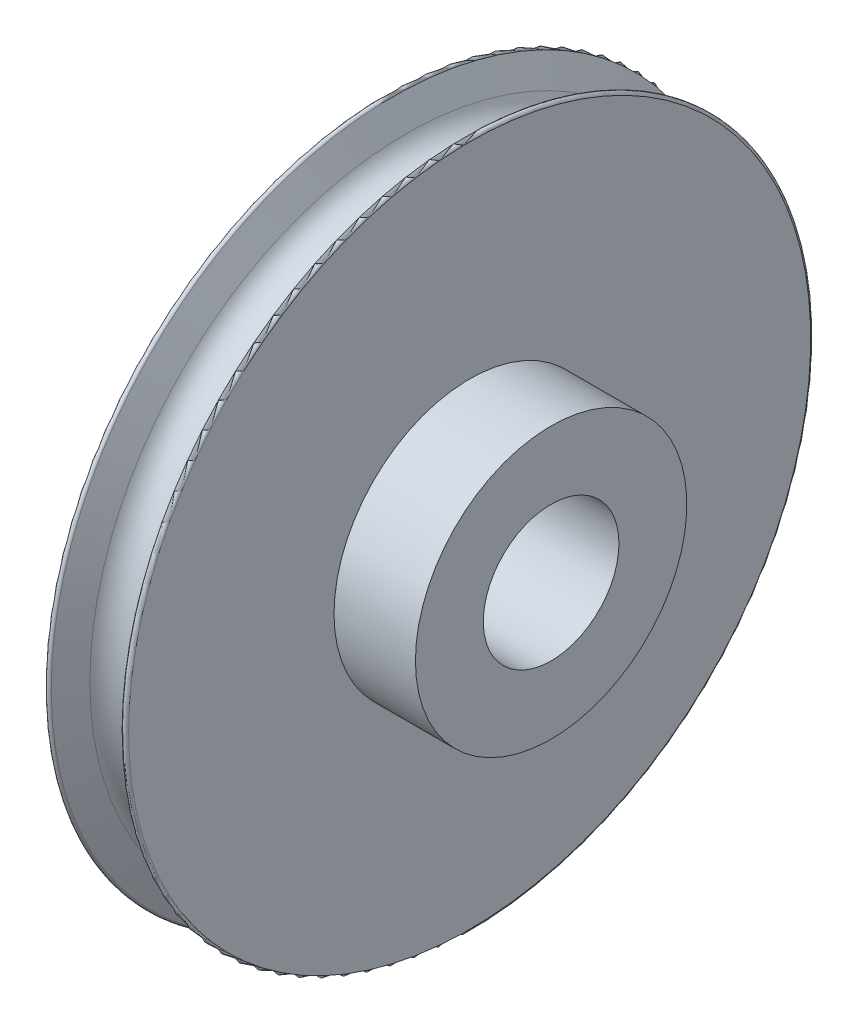
ISO-10303-21;
HEADER;
FILE_DESCRIPTION(('STEP AP214'),'2;1');
FILE_NAME('part.step','',(''),(''),'','','');
FILE_SCHEMA(('AUTOMOTIVE_DESIGN { 1 0 10303 214 1 1 1 1 }'));
ENDSEC;
DATA;
#1=APPLICATION_CONTEXT('core data for automotive mechanical design processes');
#2=APPLICATION_PROTOCOL_DEFINITION('international standard','automotive_design',2000,#1);
#3=PRODUCT_CONTEXT('',#1,'mechanical');
#4=PRODUCT('Part','Part','',(#3));
#5=PRODUCT_RELATED_PRODUCT_CATEGORY('part','',(#4));
#6=PRODUCT_DEFINITION_FORMATION('','',#4);
#7=PRODUCT_DEFINITION_CONTEXT('part definition',#1,'design');
#8=PRODUCT_DEFINITION('design','',#6,#7);
#9=PRODUCT_DEFINITION_SHAPE('','',#8);
#10=(LENGTH_UNIT() NAMED_UNIT(*) SI_UNIT(.MILLI.,.METRE.));
#11=(NAMED_UNIT(*) PLANE_ANGLE_UNIT() SI_UNIT($,.RADIAN.));
#12=(NAMED_UNIT(*) SI_UNIT($,.STERADIAN.) SOLID_ANGLE_UNIT());
#13=UNCERTAINTY_MEASURE_WITH_UNIT(LENGTH_MEASURE(1.E-05),#10,'distance_accuracy_value','');
#14=(GEOMETRIC_REPRESENTATION_CONTEXT(3) GLOBAL_UNCERTAINTY_ASSIGNED_CONTEXT((#13)) GLOBAL_UNIT_ASSIGNED_CONTEXT((#10,
#11,#12)) REPRESENTATION_CONTEXT('',''));
#15=CARTESIAN_POINT('',(0.,0.,0.));
#16=DIRECTION('',(0.,0.,1.));
#17=DIRECTION('',(1.,0.,0.));
#18=AXIS2_PLACEMENT_3D('',#15,#16,#17);
#19=CARTESIAN_POINT('',(0.,0.,0.));
#20=DIRECTION('',(-1.,0.,0.));
#21=DIRECTION('',(0.,0.,1.));
#22=AXIS2_PLACEMENT_3D('',#19,#20,#21);
#23=TOROIDAL_SURFACE('',#22,15.319375,1.190625);
#24=CARTESIAN_POINT('',(-1.07022471910112,0.,0.));
#25=DIRECTION('',(-1.,0.,0.));
#26=DIRECTION('',(0.,0.,1.));
#27=AXIS2_PLACEMENT_3D('',#24,#25,#26);
#28=CIRCLE('',#27,14.7976404494382);
#29=CARTESIAN_POINT('',(-1.07022471910112,0.,14.7976404494382));
#30=VERTEX_POINT('',#29);
#31=EDGE_CURVE('E75',#30,#30,#28,.T.);
#32=ORIENTED_EDGE('',*,*,#31,.F.);
#33=EDGE_LOOP('',(#32));
#34=FACE_BOUND('',#33,.T.);
#35=CARTESIAN_POINT('',(1.07022471910112,0.,0.));
#36=DIRECTION('',(-1.,0.,0.));
#37=DIRECTION('',(0.,0.,1.));
#38=AXIS2_PLACEMENT_3D('',#35,#36,#37);
#39=CIRCLE('',#38,14.7976404494382);
#40=CARTESIAN_POINT('',(1.07022471910112,0.,14.7976404494382));
#41=VERTEX_POINT('',#40);
#42=EDGE_CURVE('E79',#41,#41,#39,.T.);
#43=ORIENTED_EDGE('',*,*,#42,.T.);
#44=EDGE_LOOP('',(#43));
#45=FACE_BOUND('',#44,.T.);
#46=ADVANCED_FACE('F44',(#34,#45),#23,.F.);
#47=CARTESIAN_POINT('',(-1.07022471910112,0.,0.));
#48=DIRECTION('',(-1.,0.,0.));
#49=DIRECTION('',(0.,0.,1.));
#50=AXIS2_PLACEMENT_3D('',#47,#48,#49);
#51=CONICAL_SURFACE('',#50,14.7976404494382,1.1171986306871);
#52=CARTESIAN_POINT('',(-1.66384269662921,0.,0.));
#53=DIRECTION('',(1.,0.,0.));
#54=DIRECTION('',(0.,0.,-1.));
#55=AXIS2_PLACEMENT_3D('',#52,#53,#54);
#56=CIRCLE('',#55,16.0153183520599);
#57=CARTESIAN_POINT('',(-1.66384269662921,0.,-16.0153183520599));
#58=VERTEX_POINT('',#57);
#59=EDGE_CURVE('E62',#58,#58,#56,.T.);
#60=ORIENTED_EDGE('',*,*,#59,.T.);
#61=EDGE_LOOP('',(#60));
#62=FACE_BOUND('',#61,.T.);
#63=ORIENTED_EDGE('',*,*,#31,.T.);
#64=EDGE_LOOP('',(#63));
#65=FACE_BOUND('',#64,.T.);
#66=ADVANCED_FACE('F122',(#62,#65),#51,.T.);
#67=CARTESIAN_POINT('',(-1.905,0.,0.));
#68=DIRECTION('',(1.,0.,0.));
#69=DIRECTION('',(0.,0.,-1.));
#70=AXIS2_PLACEMENT_3D('',#67,#68,#69);
#71=PLANE('',#70);
#72=CARTESIAN_POINT('',(-1.905,0.,0.));
#73=DIRECTION('',(1.,0.,0.));
#74=DIRECTION('',(0.,0.,-1.));
#75=AXIS2_PLACEMENT_3D('',#72,#73,#74);
#76=CIRCLE('',#75,3.175);
#77=CARTESIAN_POINT('',(-1.905,0.,-3.175));
#78=VERTEX_POINT('',#77);
#79=EDGE_CURVE('E89',#78,#78,#76,.T.);
#80=ORIENTED_EDGE('',*,*,#79,.T.);
#81=EDGE_LOOP('',(#80));
#82=FACE_BOUND('',#81,.T.);
#83=CARTESIAN_POINT('',(-1.905,0.,0.));
#84=DIRECTION('',(1.,0.,0.));
#85=DIRECTION('',(0.,0.,-1.));
#86=AXIS2_PLACEMENT_3D('',#83,#84,#85);
#87=CIRCLE('',#86,15.9596666666666);
#88=CARTESIAN_POINT('',(-1.905,0.,-15.9596666666666));
#89=VERTEX_POINT('',#88);
#90=EDGE_CURVE('E69',#89,#89,#87,.F.);
#91=ORIENTED_EDGE('',*,*,#90,.T.);
#92=EDGE_LOOP('',(#91));
#93=FACE_BOUND('',#92,.T.);
#94=ADVANCED_FACE('F128',(#82,#93),#71,.F.);
#95=CARTESIAN_POINT('',(1.905,0.,0.));
#96=DIRECTION('',(-1.,0.,0.));
#97=DIRECTION('',(0.,0.,1.));
#98=AXIS2_PLACEMENT_3D('',#95,#96,#97);
#99=PLANE('',#98);
#100=CARTESIAN_POINT('',(1.905,0.,0.));
#101=DIRECTION('',(-1.,0.,0.));
#102=DIRECTION('',(0.,0.,1.));
#103=AXIS2_PLACEMENT_3D('',#100,#101,#102);
#104=CIRCLE('',#103,6.35);
#105=CARTESIAN_POINT('',(1.905,0.,6.35));
#106=VERTEX_POINT('',#105);
#107=EDGE_CURVE('E11',#106,#106,#104,.F.);
#108=ORIENTED_EDGE('',*,*,#107,.F.);
#109=EDGE_LOOP('',(#108));
#110=FACE_BOUND('',#109,.T.);
#111=CARTESIAN_POINT('',(1.905,0.,0.));
#112=DIRECTION('',(-1.,0.,0.));
#113=DIRECTION('',(0.,0.,1.));
#114=AXIS2_PLACEMENT_3D('',#111,#112,#113);
#115=CIRCLE('',#114,15.9596666666666);
#116=CARTESIAN_POINT('',(1.905,0.,15.9596666666666));
#117=VERTEX_POINT('',#116);
#118=EDGE_CURVE('E52',#117,#117,#115,.F.);
#119=ORIENTED_EDGE('',*,*,#118,.T.);
#120=EDGE_LOOP('',(#119));
#121=FACE_BOUND('',#120,.T.);
#122=ADVANCED_FACE('F140',(#110,#121),#99,.F.);
#123=CARTESIAN_POINT('',(1.90500000000005,0.,0.));
#124=DIRECTION('',(1.,0.,0.));
#125=DIRECTION('',(0.,0.,-1.));
#126=AXIS2_PLACEMENT_3D('',#123,#124,#125);
#127=CONICAL_SURFACE('',#126,16.51,1.1171986306871);
#128=CARTESIAN_POINT('',(1.66384269662922,0.,0.));
#129=DIRECTION('',(-1.,0.,0.));
#130=DIRECTION('',(0.,0.,1.));
#131=AXIS2_PLACEMENT_3D('',#128,#129,#130);
#132=CIRCLE('',#131,16.0153183520599);
#133=CARTESIAN_POINT('',(1.66384269662922,0.,16.0153183520599));
#134=VERTEX_POINT('',#133);
#135=EDGE_CURVE('E57',#134,#134,#132,.T.);
#136=ORIENTED_EDGE('',*,*,#135,.T.);
#137=EDGE_LOOP('',(#136));
#138=FACE_BOUND('',#137,.T.);
#139=ORIENTED_EDGE('',*,*,#42,.F.);
#140=EDGE_LOOP('',(#139));
#141=FACE_BOUND('',#140,.T.);
#142=ADVANCED_FACE('F135',(#138,#141),#127,.T.);
#143=CARTESIAN_POINT('',(-1.778,0.,0.));
#144=DIRECTION('',(1.,0.,0.));
#145=DIRECTION('',(0.,0.,-1.));
#146=AXIS2_PLACEMENT_3D('',#143,#144,#145);
#147=TOROIDAL_SURFACE('',#146,15.9596666666666,0.127);
#148=ORIENTED_EDGE('',*,*,#59,.F.);
#149=EDGE_LOOP('',(#148));
#150=FACE_BOUND('',#149,.T.);
#151=ORIENTED_EDGE('',*,*,#90,.F.);
#152=EDGE_LOOP('',(#151));
#153=FACE_BOUND('',#152,.T.);
#154=ADVANCED_FACE('F118',(#150,#153),#147,.T.);
#155=CARTESIAN_POINT('',(1.778,0.,0.));
#156=DIRECTION('',(-1.,0.,0.));
#157=DIRECTION('',(0.,0.,1.));
#158=AXIS2_PLACEMENT_3D('',#155,#156,#157);
#159=TOROIDAL_SURFACE('',#158,15.9596666666666,0.127);
#160=ORIENTED_EDGE('',*,*,#118,.F.);
#161=EDGE_LOOP('',(#160));
#162=FACE_BOUND('',#161,.T.);
#163=ORIENTED_EDGE('',*,*,#135,.F.);
#164=EDGE_LOOP('',(#163));
#165=FACE_BOUND('',#164,.T.);
#166=ADVANCED_FACE('F46',(#162,#165),#159,.T.);
#167=CARTESIAN_POINT('',(5.715,0.,0.));
#168=DIRECTION('',(-1.,0.,0.));
#169=DIRECTION('',(0.,0.,1.));
#170=AXIS2_PLACEMENT_3D('',#167,#168,#169);
#171=CYLINDRICAL_SURFACE('',#170,6.35);
#172=CARTESIAN_POINT('',(5.715,0.,0.));
#173=DIRECTION('',(1.,0.,0.));
#174=DIRECTION('',(0.,0.,-1.));
#175=AXIS2_PLACEMENT_3D('',#172,#173,#174);
#176=CIRCLE('',#175,6.35);
#177=CARTESIAN_POINT('',(5.715,0.,6.35));
#178=VERTEX_POINT('',#177);
#179=EDGE_CURVE('E84',#178,#178,#176,.T.);
#180=CARTESIAN_POINT('',(5.715,0.,6.35));
#181=CARTESIAN_POINT('',(5.6753125,0.,6.35));
#182=CARTESIAN_POINT('',(5.635625,0.,6.35));
#183=CARTESIAN_POINT('',(5.55625,0.,6.35));
#184=CARTESIAN_POINT('',(5.5165625,0.,6.35));
#185=CARTESIAN_POINT('',(5.4371875,0.,6.35));
#186=CARTESIAN_POINT('',(5.3975,0.,6.35));
#187=CARTESIAN_POINT('',(5.318125,0.,6.35));
#188=CARTESIAN_POINT('',(5.2784375,0.,6.35));
#189=CARTESIAN_POINT('',(5.1990625,0.,6.35));
#190=CARTESIAN_POINT('',(5.159375,0.,6.35));
#191=CARTESIAN_POINT('',(5.08,0.,6.35));
#192=CARTESIAN_POINT('',(5.0403125,0.,6.35));
#193=CARTESIAN_POINT('',(4.9609375,0.,6.35));
#194=CARTESIAN_POINT('',(4.92125,0.,6.35));
#195=CARTESIAN_POINT('',(4.841875,0.,6.35));
#196=CARTESIAN_POINT('',(4.8021875,0.,6.35));
#197=CARTESIAN_POINT('',(4.7228125,0.,6.35));
#198=CARTESIAN_POINT('',(4.683125,0.,6.35));
#199=CARTESIAN_POINT('',(4.60375,0.,6.35));
#200=CARTESIAN_POINT('',(4.5640625,0.,6.35));
#201=CARTESIAN_POINT('',(4.4846875,0.,6.35));
#202=CARTESIAN_POINT('',(4.445,0.,6.35));
#203=CARTESIAN_POINT('',(4.365625,0.,6.35));
#204=CARTESIAN_POINT('',(4.3259375,0.,6.35));
#205=CARTESIAN_POINT('',(4.2465625,0.,6.35));
#206=CARTESIAN_POINT('',(4.206875,0.,6.35));
#207=CARTESIAN_POINT('',(4.1275,0.,6.35));
#208=CARTESIAN_POINT('',(4.0878125,0.,6.35));
#209=CARTESIAN_POINT('',(4.0084375,0.,6.35));
#210=CARTESIAN_POINT('',(3.96875,0.,6.35));
#211=CARTESIAN_POINT('',(3.889375,0.,6.35));
#212=CARTESIAN_POINT('',(3.8496875,0.,6.35));
#213=CARTESIAN_POINT('',(3.7703125,0.,6.35));
#214=CARTESIAN_POINT('',(3.730625,0.,6.35));
#215=CARTESIAN_POINT('',(3.65125,0.,6.35));
#216=CARTESIAN_POINT('',(3.6115625,0.,6.35));
#217=CARTESIAN_POINT('',(3.5321875,0.,6.35));
#218=CARTESIAN_POINT('',(3.4925,0.,6.35));
#219=CARTESIAN_POINT('',(3.413125,0.,6.35));
#220=CARTESIAN_POINT('',(3.3734375,0.,6.35));
#221=CARTESIAN_POINT('',(3.2940625,0.,6.35));
#222=CARTESIAN_POINT('',(3.254375,0.,6.35));
#223=CARTESIAN_POINT('',(3.175,0.,6.35));
#224=CARTESIAN_POINT('',(3.1353125,0.,6.35));
#225=CARTESIAN_POINT('',(3.0559375,0.,6.35));
#226=CARTESIAN_POINT('',(3.01625,0.,6.35));
#227=CARTESIAN_POINT('',(2.936875,0.,6.35));
#228=CARTESIAN_POINT('',(2.8971875,0.,6.35));
#229=CARTESIAN_POINT('',(2.8178125,0.,6.35));
#230=CARTESIAN_POINT('',(2.778125,0.,6.35));
#231=CARTESIAN_POINT('',(2.69875,0.,6.35));
#232=CARTESIAN_POINT('',(2.6590625,0.,6.35));
#233=CARTESIAN_POINT('',(2.5796875,0.,6.35));
#234=CARTESIAN_POINT('',(2.54,0.,6.35));
#235=CARTESIAN_POINT('',(2.460625,0.,6.35));
#236=CARTESIAN_POINT('',(2.4209375,0.,6.35));
#237=CARTESIAN_POINT('',(2.3415625,0.,6.35));
#238=CARTESIAN_POINT('',(2.301875,0.,6.35));
#239=CARTESIAN_POINT('',(2.2225,0.,6.35));
#240=CARTESIAN_POINT('',(2.1828125,0.,6.35));
#241=CARTESIAN_POINT('',(2.1034375,0.,6.35));
#242=CARTESIAN_POINT('',(2.06375,0.,6.35));
#243=CARTESIAN_POINT('',(1.984375,0.,6.35));
#244=CARTESIAN_POINT('',(1.9446875,0.,6.35));
#245=CARTESIAN_POINT('',(1.905,0.,6.35));
#246=B_SPLINE_CURVE_WITH_KNOTS('',3,(#180,#181,#182,#183,#184,#185,#186,#187,#188,#189,#190,
#191,#192,#193,#194,#195,#196,#197,#198,#199,#200,#201,#202,#203,#204,#205,#206,#207,#208,#209,
#210,#211,#212,#213,#214,#215,#216,#217,#218,#219,#220,#221,#222,#223,#224,#225,#226,#227,#228,
#229,#230,#231,#232,#233,#234,#235,#236,#237,#238,#239,#240,#241,#242,#243,#244,#245),
.UNSPECIFIED.,.F.,.F.,(4,2,2,2,2,2,2,2,2,2,2,2,2,2,2,2,2,2,2,2,2,2,2,2,2,2,2,2,2,2,2,2,4),(0.,
0.1190625,0.238125,0.3571875,0.47625,0.5953125,0.714375,0.8334375,0.9525,1.0715625,1.190625,
1.3096875,1.42875,1.5478125,1.666875,1.7859375,1.905,2.0240625,2.143125,2.2621875,2.38125,
2.5003125,2.619375,2.7384375,2.8575,2.9765625,3.095625,3.2146875,3.33375,3.4528125,3.571875,
3.6909375,3.81),.UNSPECIFIED.);
#247=EDGE_CURVE('BSEAM109',#178,#106,#246,.T.);
#248=ORIENTED_EDGE('',*,*,#179,.F.);
#249=ORIENTED_EDGE('',*,*,#107,.T.);
#250=ORIENTED_EDGE('',*,*,#247,.T.);
#251=ORIENTED_EDGE('',*,*,#247,.F.);
#252=EDGE_LOOP('',(#248,#250,#249,#251));
#253=FACE_BOUND('',#252,.T.);
#254=ADVANCED_FACE('F109',(#253),#171,.T.);
#255=CARTESIAN_POINT('',(5.715,0.,0.));
#256=DIRECTION('',(1.,0.,0.));
#257=DIRECTION('',(0.,0.,-1.));
#258=AXIS2_PLACEMENT_3D('',#255,#256,#257);
#259=PLANE('',#258);
#260=CARTESIAN_POINT('',(5.715,0.,0.));
#261=DIRECTION('',(1.,0.,0.));
#262=DIRECTION('',(0.,0.,-1.));
#263=AXIS2_PLACEMENT_3D('',#260,#261,#262);
#264=CIRCLE('',#263,3.175);
#265=CARTESIAN_POINT('',(5.715,0.,-3.175));
#266=VERTEX_POINT('',#265);
#267=EDGE_CURVE('E90',#266,#266,#264,.T.);
#268=ORIENTED_EDGE('',*,*,#267,.F.);
#269=EDGE_LOOP('',(#268));
#270=FACE_BOUND('',#269,.T.);
#271=ORIENTED_EDGE('',*,*,#179,.T.);
#272=EDGE_LOOP('',(#271));
#273=FACE_BOUND('',#272,.T.);
#274=ADVANCED_FACE('F106',(#270,#273),#259,.T.);
#275=CARTESIAN_POINT('',(-1.905,0.,0.));
#276=DIRECTION('',(1.,0.,0.));
#277=DIRECTION('',(0.,0.,-1.));
#278=AXIS2_PLACEMENT_3D('',#275,#276,#277);
#279=CYLINDRICAL_SURFACE('',#278,3.175);
#280=CARTESIAN_POINT('',(-1.905,0.,-3.175));
#281=CARTESIAN_POINT('',(-1.825625,0.,-3.175));
#282=CARTESIAN_POINT('',(-1.74625,0.,-3.175));
#283=CARTESIAN_POINT('',(-1.5875,0.,-3.175));
#284=CARTESIAN_POINT('',(-1.508125,0.,-3.175));
#285=CARTESIAN_POINT('',(-1.349375,0.,-3.175));
#286=CARTESIAN_POINT('',(-1.27,0.,-3.175));
#287=CARTESIAN_POINT('',(-1.11125,0.,-3.175));
#288=CARTESIAN_POINT('',(-1.031875,0.,-3.175));
#289=CARTESIAN_POINT('',(-0.873125,0.,-3.175));
#290=CARTESIAN_POINT('',(-0.79375,0.,-3.175));
#291=CARTESIAN_POINT('',(-0.635,0.,-3.175));
#292=CARTESIAN_POINT('',(-0.555625,0.,-3.175));
#293=CARTESIAN_POINT('',(-0.396875,0.,-3.175));
#294=CARTESIAN_POINT('',(-0.3175,0.,-3.175));
#295=CARTESIAN_POINT('',(-0.15875,0.,-3.175));
#296=CARTESIAN_POINT('',(-0.0793749999999996,0.,-3.175));
#297=CARTESIAN_POINT('',(0.0793750000000004,0.,-3.175));
#298=CARTESIAN_POINT('',(0.15875,0.,-3.175));
#299=CARTESIAN_POINT('',(0.317500000000001,0.,-3.175));
#300=CARTESIAN_POINT('',(0.396875000000001,0.,-3.175));
#301=CARTESIAN_POINT('',(0.555625000000001,0.,-3.175));
#302=CARTESIAN_POINT('',(0.635000000000001,0.,-3.175));
#303=CARTESIAN_POINT('',(0.793750000000001,0.,-3.175));
#304=CARTESIAN_POINT('',(0.873125000000001,0.,-3.175));
#305=CARTESIAN_POINT('',(1.031875,0.,-3.175));
#306=CARTESIAN_POINT('',(1.11125,0.,-3.175));
#307=CARTESIAN_POINT('',(1.27,0.,-3.175));
#308=CARTESIAN_POINT('',(1.349375,0.,-3.175));
#309=CARTESIAN_POINT('',(1.508125,0.,-3.175));
#310=CARTESIAN_POINT('',(1.5875,0.,-3.175));
#311=CARTESIAN_POINT('',(1.74625,0.,-3.175));
#312=CARTESIAN_POINT('',(1.825625,0.,-3.175));
#313=CARTESIAN_POINT('',(1.984375,0.,-3.175));
#314=CARTESIAN_POINT('',(2.06375,0.,-3.175));
#315=CARTESIAN_POINT('',(2.2225,0.,-3.175));
#316=CARTESIAN_POINT('',(2.301875,0.,-3.175));
#317=CARTESIAN_POINT('',(2.460625,0.,-3.175));
#318=CARTESIAN_POINT('',(2.54,0.,-3.175));
#319=CARTESIAN_POINT('',(2.69875,0.,-3.175));
#320=CARTESIAN_POINT('',(2.778125,0.,-3.175));
#321=CARTESIAN_POINT('',(2.936875,0.,-3.175));
#322=CARTESIAN_POINT('',(3.01625,0.,-3.175));
#323=CARTESIAN_POINT('',(3.175,0.,-3.175));
#324=CARTESIAN_POINT('',(3.254375,0.,-3.175));
#325=CARTESIAN_POINT('',(3.413125,0.,-3.175));
#326=CARTESIAN_POINT('',(3.4925,0.,-3.175));
#327=CARTESIAN_POINT('',(3.65125,0.,-3.175));
#328=CARTESIAN_POINT('',(3.730625,0.,-3.175));
#329=CARTESIAN_POINT('',(3.889375,0.,-3.175));
#330=CARTESIAN_POINT('',(3.96875,0.,-3.175));
#331=CARTESIAN_POINT('',(4.1275,0.,-3.175));
#332=CARTESIAN_POINT('',(4.206875,0.,-3.175));
#333=CARTESIAN_POINT('',(4.365625,0.,-3.175));
#334=CARTESIAN_POINT('',(4.445,0.,-3.175));
#335=CARTESIAN_POINT('',(4.60375,0.,-3.175));
#336=CARTESIAN_POINT('',(4.683125,0.,-3.175));
#337=CARTESIAN_POINT('',(4.841875,0.,-3.175));
#338=CARTESIAN_POINT('',(4.92125,0.,-3.175));
#339=CARTESIAN_POINT('',(5.08,0.,-3.175));
#340=CARTESIAN_POINT('',(5.159375,0.,-3.175));
#341=CARTESIAN_POINT('',(5.318125,0.,-3.175));
#342=CARTESIAN_POINT('',(5.3975,0.,-3.175));
#343=CARTESIAN_POINT('',(5.55625,0.,-3.175));
#344=CARTESIAN_POINT('',(5.635625,0.,-3.175));
#345=CARTESIAN_POINT('',(5.715,0.,-3.175));
#346=B_SPLINE_CURVE_WITH_KNOTS('',3,(#280,#281,#282,#283,#284,#285,#286,#287,#288,#289,#290,
#291,#292,#293,#294,#295,#296,#297,#298,#299,#300,#301,#302,#303,#304,#305,#306,#307,#308,#309,
#310,#311,#312,#313,#314,#315,#316,#317,#318,#319,#320,#321,#322,#323,#324,#325,#326,#327,#328,
#329,#330,#331,#332,#333,#334,#335,#336,#337,#338,#339,#340,#341,#342,#343,#344,#345),
.UNSPECIFIED.,.F.,.F.,(4,2,2,2,2,2,2,2,2,2,2,2,2,2,2,2,2,2,2,2,2,2,2,2,2,2,2,2,2,2,2,2,4),(0.,
0.238125,0.47625,0.714375,0.9525,1.190625,1.42875,1.666875,1.905,2.143125,2.38125,2.619375,
2.8575,3.095625,3.33375,3.571875,3.81,4.048125,4.28625,4.524375,4.7625,5.000625,5.23875,
5.476875,5.715,5.953125,6.19125,6.429375,6.6675,6.905625,7.14375,7.381875,7.62),.UNSPECIFIED.);
#347=EDGE_CURVE('BSEAM104',#78,#266,#346,.T.);
#348=ORIENTED_EDGE('',*,*,#79,.F.);
#349=ORIENTED_EDGE('',*,*,#267,.T.);
#350=ORIENTED_EDGE('',*,*,#347,.T.);
#351=ORIENTED_EDGE('',*,*,#347,.F.);
#352=EDGE_LOOP('',(#348,#350,#349,#351));
#353=FACE_BOUND('',#352,.T.);
#354=ADVANCED_FACE('F104',(#353),#279,.F.);
#355=CLOSED_SHELL('',(#46,#66,#94,#122,#142,#154,#166,#254,#274,#354));
#356=MANIFOLD_SOLID_BREP('B2',#355);
#357=ADVANCED_BREP_SHAPE_REPRESENTATION('',(#18,#356),#14);
#358=SHAPE_DEFINITION_REPRESENTATION(#9,#357);
ENDSEC;
END-ISO-10303-21;
